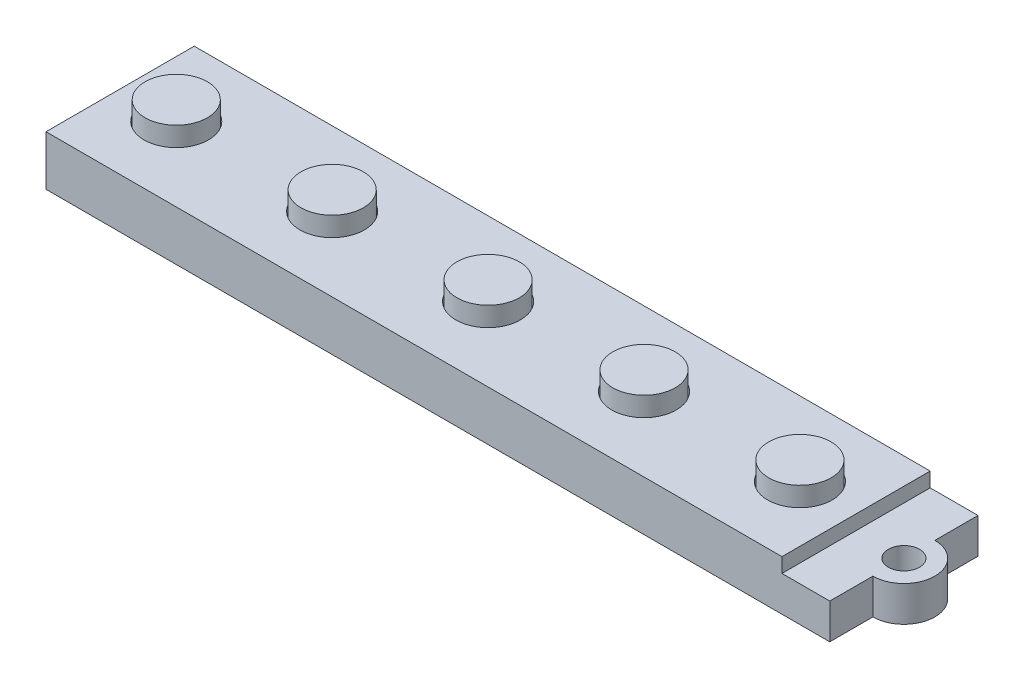
ISO-10303-21;
HEADER;
FILE_DESCRIPTION(('STEP AP214'),'2;1');
FILE_NAME('part.step','',(''),(''),'','','');
FILE_SCHEMA(('AUTOMOTIVE_DESIGN { 1 0 10303 214 1 1 1 1 }'));
ENDSEC;
DATA;
#1=APPLICATION_CONTEXT('core data for automotive mechanical design processes');
#2=APPLICATION_PROTOCOL_DEFINITION('international standard','automotive_design',2000,#1);
#3=PRODUCT_CONTEXT('',#1,'mechanical');
#4=PRODUCT('Part','Part','',(#3));
#5=PRODUCT_RELATED_PRODUCT_CATEGORY('part','',(#4));
#6=PRODUCT_DEFINITION_FORMATION('','',#4);
#7=PRODUCT_DEFINITION_CONTEXT('part definition',#1,'design');
#8=PRODUCT_DEFINITION('design','',#6,#7);
#9=PRODUCT_DEFINITION_SHAPE('','',#8);
#10=(LENGTH_UNIT() NAMED_UNIT(*) SI_UNIT(.MILLI.,.METRE.));
#11=(NAMED_UNIT(*) PLANE_ANGLE_UNIT() SI_UNIT($,.RADIAN.));
#12=(NAMED_UNIT(*) SI_UNIT($,.STERADIAN.) SOLID_ANGLE_UNIT());
#13=UNCERTAINTY_MEASURE_WITH_UNIT(LENGTH_MEASURE(1.E-05),#10,'distance_accuracy_value','');
#14=(GEOMETRIC_REPRESENTATION_CONTEXT(3) GLOBAL_UNCERTAINTY_ASSIGNED_CONTEXT((#13)) GLOBAL_UNIT_ASSIGNED_CONTEXT((#10,
#11,#12)) REPRESENTATION_CONTEXT('',''));
#15=CARTESIAN_POINT('',(0.,0.,0.));
#16=DIRECTION('',(0.,0.,1.));
#17=DIRECTION('',(1.,0.,0.));
#18=AXIS2_PLACEMENT_3D('',#15,#16,#17);
#19=CARTESIAN_POINT('',(0.,0.,0.));
#20=DIRECTION('',(0.,1.,0.));
#21=DIRECTION('',(0.,0.,1.));
#22=AXIS2_PLACEMENT_3D('',#19,#20,#21);
#23=PLANE('',#22);
#24=CARTESIAN_POINT('',(-20.4046666666667,0.,-25.8942737373737));
#25=DIRECTION('',(0.,1.,0.));
#26=DIRECTION('',(0.,0.,1.));
#27=AXIS2_PLACEMENT_3D('',#24,#25,#26);
#28=CIRCLE('',#27,1.905);
#29=CARTESIAN_POINT('',(-20.4046666666667,0.,-23.9892737373737));
#30=VERTEX_POINT('',#29);
#31=EDGE_CURVE('E220',#30,#30,#28,.T.);
#32=ORIENTED_EDGE('',*,*,#31,.T.);
#33=EDGE_LOOP('',(#32));
#34=FACE_BOUND('',#33,.T.);
#35=DIRECTION('',(0.,0.,-1.));
#36=VECTOR('',#35,1.);
#37=CARTESIAN_POINT('',(-112.479666666667,0.,-32.2442737373737));
#38=LINE('',#37,#36);
#39=CARTESIAN_POINT('',(-112.479666666667,0.,-19.5442737373737));
#40=VERTEX_POINT('',#39);
#41=CARTESIAN_POINT('',(-112.479666666667,0.,-32.2442737373737));
#42=VERTEX_POINT('',#41);
#43=EDGE_CURVE('E159',#40,#42,#38,.T.);
#44=ORIENTED_EDGE('',*,*,#43,.F.);
#45=DIRECTION('',(-1.,0.,0.));
#46=VECTOR('',#45,1.);
#47=CARTESIAN_POINT('',(-29.9296666666666,0.,-19.5442737373737));
#48=LINE('',#47,#46);
#49=CARTESIAN_POINT('',(-29.9296666666666,0.,-19.5442737373737));
#50=VERTEX_POINT('',#49);
#51=EDGE_CURVE('E164',#50,#40,#48,.T.);
#52=ORIENTED_EDGE('',*,*,#51,.F.);
#53=DIRECTION('',(0.,0.,1.));
#54=VECTOR('',#53,1.);
#55=CARTESIAN_POINT('',(-29.9296666666666,0.,-32.2442737373737));
#56=LINE('',#55,#54);
#57=CARTESIAN_POINT('',(-29.9296666666666,0.,-32.2442737373737));
#58=VERTEX_POINT('',#57);
#59=EDGE_CURVE('E174',#58,#50,#56,.T.);
#60=ORIENTED_EDGE('',*,*,#59,.F.);
#61=DIRECTION('',(1.,0.,0.));
#62=VECTOR('',#61,1.);
#63=CARTESIAN_POINT('',(-29.9296666666666,0.,-32.2442737373737));
#64=LINE('',#63,#62);
#65=EDGE_CURVE('E57',#42,#58,#64,.T.);
#66=ORIENTED_EDGE('',*,*,#65,.F.);
#67=EDGE_LOOP('',(#44,#52,#60,#66));
#68=FACE_BOUND('',#67,.T.);
#69=DIRECTION('',(-1.,0.,0.));
#70=VECTOR('',#69,1.);
#71=CARTESIAN_POINT('',(-116.162666666667,0.,-34.9493737373737));
#72=LINE('',#71,#70);
#73=CARTESIAN_POINT('',(-20.4046666666667,0.,-34.9493737373737));
#74=VERTEX_POINT('',#73);
#75=CARTESIAN_POINT('',(-116.162666666667,0.,-34.9493737373737));
#76=VERTEX_POINT('',#75);
#77=EDGE_CURVE('E242',#74,#76,#72,.T.);
#78=ORIENTED_EDGE('',*,*,#77,.F.);
#79=DIRECTION('',(0.,0.,1.));
#80=VECTOR('',#79,1.);
#81=CARTESIAN_POINT('',(-20.4046666666667,0.,0.));
#82=LINE('',#81,#80);
#83=CARTESIAN_POINT('',(-20.4046666666667,0.,-29.6800450522713));
#84=VERTEX_POINT('',#83);
#85=EDGE_CURVE('E156',#74,#84,#82,.T.);
#86=ORIENTED_EDGE('',*,*,#85,.T.);
#87=CARTESIAN_POINT('',(-20.4046666666667,0.,-25.8942737373737));
#88=DIRECTION('',(0.,1.,0.));
#89=DIRECTION('',(0.,0.,1.));
#90=AXIS2_PLACEMENT_3D('',#87,#88,#89);
#91=CIRCLE('',#90,3.78577131489756);
#92=CARTESIAN_POINT('',(-20.4046666666667,0.,-22.1085024224762));
#93=VERTEX_POINT('',#92);
#94=EDGE_CURVE('E152',#84,#93,#91,.F.);
#95=ORIENTED_EDGE('',*,*,#94,.T.);
#96=DIRECTION('',(0.,0.,1.));
#97=VECTOR('',#96,1.);
#98=CARTESIAN_POINT('',(-20.4046666666666,0.,0.));
#99=LINE('',#98,#97);
#100=CARTESIAN_POINT('',(-20.4046666666666,0.,-16.8391737373737));
#101=VERTEX_POINT('',#100);
#102=EDGE_CURVE('E130',#93,#101,#99,.T.);
#103=ORIENTED_EDGE('',*,*,#102,.T.);
#104=DIRECTION('',(1.,0.,0.));
#105=VECTOR('',#104,1.);
#106=CARTESIAN_POINT('',(-116.162666666667,0.,-16.8391737373737));
#107=LINE('',#106,#105);
#108=CARTESIAN_POINT('',(-116.162666666667,0.,-16.8391737373737));
#109=VERTEX_POINT('',#108);
#110=EDGE_CURVE('E249',#109,#101,#107,.T.);
#111=ORIENTED_EDGE('',*,*,#110,.F.);
#112=DIRECTION('',(0.,0.,1.));
#113=VECTOR('',#112,1.);
#114=CARTESIAN_POINT('',(-116.162666666667,0.,-34.9493737373737));
#115=LINE('',#114,#113);
#116=EDGE_CURVE('E235',#76,#109,#115,.T.);
#117=ORIENTED_EDGE('',*,*,#116,.F.);
#118=EDGE_LOOP('',(#78,#86,#95,#103,#111,#117));
#119=FACE_BOUND('',#118,.T.);
#120=ADVANCED_FACE('F34',(#34,#68,#119),#23,.F.);
#121=CARTESIAN_POINT('',(0.,4.318,0.));
#122=DIRECTION('',(0.,1.,0.));
#123=DIRECTION('',(0.,0.,1.));
#124=AXIS2_PLACEMENT_3D('',#121,#122,#123);
#125=PLANE('',#124);
#126=CARTESIAN_POINT('',(-20.4046666666667,4.318,-25.8942737373737));
#127=DIRECTION('',(0.,1.,0.));
#128=DIRECTION('',(0.,0.,1.));
#129=AXIS2_PLACEMENT_3D('',#126,#127,#128);
#130=CIRCLE('',#129,1.905);
#131=CARTESIAN_POINT('',(-20.4046666666667,4.318,-23.9892737373737));
#132=VERTEX_POINT('',#131);
#133=EDGE_CURVE('E217',#132,#132,#130,.T.);
#134=ORIENTED_EDGE('',*,*,#133,.F.);
#135=EDGE_LOOP('',(#134));
#136=FACE_BOUND('',#135,.T.);
#137=DIRECTION('',(0.,0.,1.));
#138=VECTOR('',#137,1.);
#139=CARTESIAN_POINT('',(-20.4046666666667,4.318,-34.9493737373737));
#140=LINE('',#139,#138);
#141=CARTESIAN_POINT('',(-20.4046666666667,4.318,-34.9493737373737));
#142=VERTEX_POINT('',#141);
#143=CARTESIAN_POINT('',(-20.4046666666667,4.318,-29.6800450522713));
#144=VERTEX_POINT('',#143);
#145=EDGE_CURVE('E49',#142,#144,#140,.T.);
#146=ORIENTED_EDGE('',*,*,#145,.F.);
#147=DIRECTION('',(-1.,0.,0.));
#148=VECTOR('',#147,1.);
#149=CARTESIAN_POINT('',(-26.2466666666667,4.318,-34.9493737373737));
#150=LINE('',#149,#148);
#151=CARTESIAN_POINT('',(-26.2466666666667,4.318,-34.9493737373737));
#152=VERTEX_POINT('',#151);
#153=EDGE_CURVE('E229',#142,#152,#150,.T.);
#154=ORIENTED_EDGE('',*,*,#153,.T.);
#155=DIRECTION('',(0.,0.,1.));
#156=VECTOR('',#155,1.);
#157=CARTESIAN_POINT('',(-26.2466666666667,4.318,-34.9493737373737));
#158=LINE('',#157,#156);
#159=CARTESIAN_POINT('',(-26.2466666666667,4.318,-16.8391737373737));
#160=VERTEX_POINT('',#159);
#161=EDGE_CURVE('E226',#152,#160,#158,.T.);
#162=ORIENTED_EDGE('',*,*,#161,.T.);
#163=DIRECTION('',(1.,0.,0.));
#164=VECTOR('',#163,1.);
#165=CARTESIAN_POINT('',(-26.2466666666667,4.318,-16.8391737373737));
#166=LINE('',#165,#164);
#167=CARTESIAN_POINT('',(-20.4046666666666,4.318,-16.8391737373737));
#168=VERTEX_POINT('',#167);
#169=EDGE_CURVE('E145',#160,#168,#166,.T.);
#170=ORIENTED_EDGE('',*,*,#169,.T.);
#171=DIRECTION('',(0.,0.,1.));
#172=VECTOR('',#171,1.);
#173=CARTESIAN_POINT('',(-20.4046666666667,4.318,-22.1085024224762));
#174=LINE('',#173,#172);
#175=CARTESIAN_POINT('',(-20.4046666666667,4.318,-22.1085024224762));
#176=VERTEX_POINT('',#175);
#177=EDGE_CURVE('E127',#176,#168,#174,.T.);
#178=ORIENTED_EDGE('',*,*,#177,.F.);
#179=CARTESIAN_POINT('',(-20.4046666666667,4.318,-25.8942737373737));
#180=DIRECTION('',(0.,-1.,0.));
#181=DIRECTION('',(0.,0.,1.));
#182=AXIS2_PLACEMENT_3D('',#179,#180,#181);
#183=CIRCLE('',#182,3.78577131489756);
#184=EDGE_CURVE('E137',#144,#176,#183,.T.);
#185=ORIENTED_EDGE('',*,*,#184,.F.);
#186=EDGE_LOOP('',(#146,#154,#162,#170,#178,#185));
#187=FACE_BOUND('',#186,.T.);
#188=ADVANCED_FACE('F142',(#136,#187),#125,.T.);
#189=CARTESIAN_POINT('',(-116.162666666667,6.096,-34.9493737373737));
#190=DIRECTION('',(1.,0.,0.));
#191=DIRECTION('',(0.,0.,-1.));
#192=AXIS2_PLACEMENT_3D('',#189,#190,#191);
#193=PLANE('',#192);
#194=ORIENTED_EDGE('',*,*,#116,.T.);
#195=DIRECTION('',(0.,-1.,0.));
#196=VECTOR('',#195,1.);
#197=CARTESIAN_POINT('',(-116.162666666667,6.096,-16.8391737373737));
#198=LINE('',#197,#196);
#199=CARTESIAN_POINT('',(-116.162666666667,6.096,-16.8391737373737));
#200=VERTEX_POINT('',#199);
#201=EDGE_CURVE('E11',#200,#109,#198,.T.);
#202=ORIENTED_EDGE('',*,*,#201,.F.);
#203=DIRECTION('',(0.,0.,1.));
#204=VECTOR('',#203,1.);
#205=CARTESIAN_POINT('',(-116.162666666667,6.096,-34.9493737373737));
#206=LINE('',#205,#204);
#207=CARTESIAN_POINT('',(-116.162666666667,6.096,-34.9493737373737));
#208=VERTEX_POINT('',#207);
#209=EDGE_CURVE('E238',#208,#200,#206,.T.);
#210=ORIENTED_EDGE('',*,*,#209,.F.);
#211=DIRECTION('',(0.,-1.,0.));
#212=VECTOR('',#211,1.);
#213=CARTESIAN_POINT('',(-116.162666666667,6.096,-34.9493737373737));
#214=LINE('',#213,#212);
#215=EDGE_CURVE('E42',#208,#76,#214,.T.);
#216=ORIENTED_EDGE('',*,*,#215,.T.);
#217=EDGE_LOOP('',(#194,#202,#210,#216));
#218=FACE_BOUND('',#217,.T.);
#219=ADVANCED_FACE('F36',(#218),#193,.F.);
#220=CARTESIAN_POINT('',(-116.162666666667,6.096,-16.8391737373737));
#221=DIRECTION('',(0.,0.,-1.));
#222=DIRECTION('',(-1.,0.,0.));
#223=AXIS2_PLACEMENT_3D('',#220,#221,#222);
#224=PLANE('',#223);
#225=ORIENTED_EDGE('',*,*,#110,.T.);
#226=DIRECTION('',(0.,1.,0.));
#227=VECTOR('',#226,1.);
#228=CARTESIAN_POINT('',(-20.4046666666666,-1.27,-16.8391737373737));
#229=LINE('',#228,#227);
#230=EDGE_CURVE('E133',#101,#168,#229,.T.);
#231=ORIENTED_EDGE('',*,*,#230,.T.);
#232=ORIENTED_EDGE('',*,*,#169,.F.);
#233=DIRECTION('',(0.,1.,0.));
#234=VECTOR('',#233,1.);
#235=CARTESIAN_POINT('',(-26.2466666666667,4.318,-16.8391737373737));
#236=LINE('',#235,#234);
#237=CARTESIAN_POINT('',(-26.2466666666667,6.096,-16.8391737373737));
#238=VERTEX_POINT('',#237);
#239=EDGE_CURVE('E231',#160,#238,#236,.T.);
#240=ORIENTED_EDGE('',*,*,#239,.T.);
#241=DIRECTION('',(1.,0.,0.));
#242=VECTOR('',#241,1.);
#243=CARTESIAN_POINT('',(-116.162666666667,6.096,-16.8391737373737));
#244=LINE('',#243,#242);
#245=EDGE_CURVE('E241',#200,#238,#244,.T.);
#246=ORIENTED_EDGE('',*,*,#245,.F.);
#247=ORIENTED_EDGE('',*,*,#201,.T.);
#248=EDGE_LOOP('',(#225,#231,#232,#240,#246,#247));
#249=FACE_BOUND('',#248,.T.);
#250=ADVANCED_FACE('F263',(#249),#224,.F.);
#251=CARTESIAN_POINT('',(-116.162666666667,6.096,-34.9493737373737));
#252=DIRECTION('',(0.,0.,1.));
#253=DIRECTION('',(1.,0.,0.));
#254=AXIS2_PLACEMENT_3D('',#251,#252,#253);
#255=PLANE('',#254);
#256=ORIENTED_EDGE('',*,*,#153,.F.);
#257=DIRECTION('',(0.,1.,0.));
#258=VECTOR('',#257,1.);
#259=CARTESIAN_POINT('',(-20.4046666666667,-1.27,-34.9493737373737));
#260=LINE('',#259,#258);
#261=EDGE_CURVE('E150',#74,#142,#260,.T.);
#262=ORIENTED_EDGE('',*,*,#261,.F.);
#263=ORIENTED_EDGE('',*,*,#77,.T.);
#264=ORIENTED_EDGE('',*,*,#215,.F.);
#265=DIRECTION('',(-1.,0.,0.));
#266=VECTOR('',#265,1.);
#267=CARTESIAN_POINT('',(-116.162666666667,6.096,-34.9493737373737));
#268=LINE('',#267,#266);
#269=CARTESIAN_POINT('',(-26.2466666666667,6.096,-34.9493737373737));
#270=VERTEX_POINT('',#269);
#271=EDGE_CURVE('E245',#270,#208,#268,.T.);
#272=ORIENTED_EDGE('',*,*,#271,.F.);
#273=DIRECTION('',(0.,1.,0.));
#274=VECTOR('',#273,1.);
#275=CARTESIAN_POINT('',(-26.2466666666667,4.318,-34.9493737373737));
#276=LINE('',#275,#274);
#277=EDGE_CURVE('E233',#152,#270,#276,.T.);
#278=ORIENTED_EDGE('',*,*,#277,.F.);
#279=EDGE_LOOP('',(#256,#262,#263,#264,#272,#278));
#280=FACE_BOUND('',#279,.T.);
#281=ADVANCED_FACE('F269',(#280),#255,.F.);
#282=CARTESIAN_POINT('',(0.,6.096,0.));
#283=DIRECTION('',(0.,1.,0.));
#284=DIRECTION('',(0.,0.,1.));
#285=AXIS2_PLACEMENT_3D('',#282,#283,#284);
#286=PLANE('',#285);
#287=CARTESIAN_POINT('',(-52.1546666666667,6.096,-25.8942737373736));
#288=DIRECTION('',(0.,1.,0.));
#289=DIRECTION('',(0.,0.,1.));
#290=AXIS2_PLACEMENT_3D('',#287,#288,#289);
#291=CIRCLE('',#290,3.937);
#292=CARTESIAN_POINT('',(-52.1546666666667,6.096,-21.9572737373736));
#293=VERTEX_POINT('',#292);
#294=EDGE_CURVE('E194',#293,#293,#291,.T.);
#295=ORIENTED_EDGE('',*,*,#294,.F.);
#296=EDGE_LOOP('',(#295));
#297=FACE_BOUND('',#296,.T.);
#298=CARTESIAN_POINT('',(-71.2046666666667,6.096,-25.8942737373734));
#299=DIRECTION('',(0.,1.,0.));
#300=DIRECTION('',(0.,0.,1.));
#301=AXIS2_PLACEMENT_3D('',#298,#299,#300);
#302=CIRCLE('',#301,3.937);
#303=CARTESIAN_POINT('',(-71.2046666666667,6.096,-21.9572737373734));
#304=VERTEX_POINT('',#303);
#305=EDGE_CURVE('E200',#304,#304,#302,.T.);
#306=ORIENTED_EDGE('',*,*,#305,.F.);
#307=EDGE_LOOP('',(#306));
#308=FACE_BOUND('',#307,.T.);
#309=CARTESIAN_POINT('',(-90.2546666666667,6.096,-25.8942737373733));
#310=DIRECTION('',(0.,1.,0.));
#311=DIRECTION('',(0.,0.,1.));
#312=AXIS2_PLACEMENT_3D('',#309,#310,#311);
#313=CIRCLE('',#312,3.937);
#314=CARTESIAN_POINT('',(-90.2546666666667,6.096,-21.9572737373733));
#315=VERTEX_POINT('',#314);
#316=EDGE_CURVE('E206',#315,#315,#313,.T.);
#317=ORIENTED_EDGE('',*,*,#316,.F.);
#318=EDGE_LOOP('',(#317));
#319=FACE_BOUND('',#318,.T.);
#320=CARTESIAN_POINT('',(-109.304666666667,6.096,-25.8942737373732));
#321=DIRECTION('',(0.,1.,0.));
#322=DIRECTION('',(0.,0.,1.));
#323=AXIS2_PLACEMENT_3D('',#320,#321,#322);
#324=CIRCLE('',#323,3.937);
#325=CARTESIAN_POINT('',(-109.304666666667,6.096,-21.9572737373732));
#326=VERTEX_POINT('',#325);
#327=EDGE_CURVE('E189',#326,#326,#324,.T.);
#328=ORIENTED_EDGE('',*,*,#327,.F.);
#329=EDGE_LOOP('',(#328));
#330=FACE_BOUND('',#329,.T.);
#331=CARTESIAN_POINT('',(-33.1046666666667,6.096,-25.8942737373737));
#332=DIRECTION('',(0.,1.,0.));
#333=DIRECTION('',(0.,0.,1.));
#334=AXIS2_PLACEMENT_3D('',#331,#332,#333);
#335=CIRCLE('',#334,3.937);
#336=CARTESIAN_POINT('',(-33.1046666666667,6.096,-21.9572737373737));
#337=VERTEX_POINT('',#336);
#338=EDGE_CURVE('E193',#337,#337,#335,.T.);
#339=ORIENTED_EDGE('',*,*,#338,.F.);
#340=EDGE_LOOP('',(#339));
#341=FACE_BOUND('',#340,.T.);
#342=DIRECTION('',(0.,0.,1.));
#343=VECTOR('',#342,1.);
#344=CARTESIAN_POINT('',(-26.2466666666667,6.096,-34.9493737373737));
#345=LINE('',#344,#343);
#346=EDGE_CURVE('E223',#270,#238,#345,.T.);
#347=ORIENTED_EDGE('',*,*,#346,.F.);
#348=ORIENTED_EDGE('',*,*,#271,.T.);
#349=ORIENTED_EDGE('',*,*,#209,.T.);
#350=ORIENTED_EDGE('',*,*,#245,.T.);
#351=EDGE_LOOP('',(#347,#348,#349,#350));
#352=FACE_BOUND('',#351,.T.);
#353=ADVANCED_FACE('F266',(#297,#308,#319,#330,#341,#352),#286,.T.);
#354=CARTESIAN_POINT('',(-26.2466666666667,4.318,-34.9493737373737));
#355=DIRECTION('',(-1.,0.,0.));
#356=DIRECTION('',(0.,0.,1.));
#357=AXIS2_PLACEMENT_3D('',#354,#355,#356);
#358=PLANE('',#357);
#359=ORIENTED_EDGE('',*,*,#346,.T.);
#360=ORIENTED_EDGE('',*,*,#239,.F.);
#361=ORIENTED_EDGE('',*,*,#161,.F.);
#362=ORIENTED_EDGE('',*,*,#277,.T.);
#363=EDGE_LOOP('',(#359,#360,#361,#362));
#364=FACE_BOUND('',#363,.T.);
#365=ADVANCED_FACE('F273',(#364),#358,.F.);
#366=CARTESIAN_POINT('',(-20.4046666666667,0.,-25.8942737373737));
#367=DIRECTION('',(0.,1.,0.));
#368=DIRECTION('',(0.,0.,1.));
#369=AXIS2_PLACEMENT_3D('',#366,#367,#368);
#370=CYLINDRICAL_SURFACE('',#369,1.905);
#371=ORIENTED_EDGE('',*,*,#31,.F.);
#372=EDGE_LOOP('',(#371));
#373=FACE_BOUND('',#372,.T.);
#374=ORIENTED_EDGE('',*,*,#133,.T.);
#375=EDGE_LOOP('',(#374));
#376=FACE_BOUND('',#375,.T.);
#377=ADVANCED_FACE('F337',(#373,#376),#370,.F.);
#378=CARTESIAN_POINT('',(-33.1046666666667,4.826,-25.8942737373737));
#379=DIRECTION('',(0.,1.,0.));
#380=DIRECTION('',(0.,0.,1.));
#381=AXIS2_PLACEMENT_3D('',#378,#379,#380);
#382=CYLINDRICAL_SURFACE('',#381,3.937);
#383=CARTESIAN_POINT('',(-33.1046666666667,4.826,-25.8942737373737));
#384=DIRECTION('',(0.,1.,0.));
#385=DIRECTION('',(0.,0.,1.));
#386=AXIS2_PLACEMENT_3D('',#383,#384,#385);
#387=CIRCLE('',#386,3.937);
#388=CARTESIAN_POINT('',(-33.1046666666667,4.826,-21.9572737373737));
#389=VERTEX_POINT('',#388);
#390=EDGE_CURVE('E214',#389,#389,#387,.T.);
#391=ORIENTED_EDGE('',*,*,#390,.F.);
#392=EDGE_LOOP('',(#391));
#393=FACE_BOUND('',#392,.T.);
#394=ORIENTED_EDGE('',*,*,#338,.T.);
#395=EDGE_LOOP('',(#394));
#396=FACE_BOUND('',#395,.T.);
#397=ADVANCED_FACE('F335',(#393,#396),#382,.F.);
#398=CARTESIAN_POINT('',(-33.1046666666667,4.826,-25.8942737373737));
#399=DIRECTION('',(0.,1.,0.));
#400=DIRECTION('',(0.,0.,1.));
#401=AXIS2_PLACEMENT_3D('',#398,#399,#400);
#402=PLANE('',#401);
#403=CARTESIAN_POINT('',(-33.1046666666667,4.826,-25.8942737373737));
#404=DIRECTION('',(0.,1.,0.));
#405=DIRECTION('',(0.,0.,1.));
#406=AXIS2_PLACEMENT_3D('',#403,#404,#405);
#407=CIRCLE('',#406,3.81);
#408=CARTESIAN_POINT('',(-33.1046666666667,4.826,-22.0842737373737));
#409=VERTEX_POINT('',#408);
#410=EDGE_CURVE('E276',#409,#409,#407,.T.);
#411=ORIENTED_EDGE('',*,*,#410,.F.);
#412=EDGE_LOOP('',(#411));
#413=FACE_BOUND('',#412,.T.);
#414=ORIENTED_EDGE('',*,*,#390,.T.);
#415=EDGE_LOOP('',(#414));
#416=FACE_BOUND('',#415,.T.);
#417=ADVANCED_FACE('F325',(#413,#416),#402,.T.);
#418=CARTESIAN_POINT('',(-109.304666666667,4.826,-25.8942737373732));
#419=DIRECTION('',(0.,1.,0.));
#420=DIRECTION('',(0.,0.,1.));
#421=AXIS2_PLACEMENT_3D('',#418,#419,#420);
#422=CYLINDRICAL_SURFACE('',#421,3.937);
#423=CARTESIAN_POINT('',(-109.304666666667,4.826,-25.8942737373732));
#424=DIRECTION('',(0.,1.,0.));
#425=DIRECTION('',(0.,0.,1.));
#426=AXIS2_PLACEMENT_3D('',#423,#424,#425);
#427=CIRCLE('',#426,3.937);
#428=CARTESIAN_POINT('',(-109.304666666667,4.826,-21.9572737373732));
#429=VERTEX_POINT('',#428);
#430=EDGE_CURVE('E209',#429,#429,#427,.T.);
#431=ORIENTED_EDGE('',*,*,#430,.F.);
#432=EDGE_LOOP('',(#431));
#433=FACE_BOUND('',#432,.T.);
#434=ORIENTED_EDGE('',*,*,#327,.T.);
#435=EDGE_LOOP('',(#434));
#436=FACE_BOUND('',#435,.T.);
#437=ADVANCED_FACE('F319',(#433,#436),#422,.F.);
#438=CARTESIAN_POINT('',(-109.304666666667,4.826,-25.8942737373732));
#439=DIRECTION('',(0.,1.,0.));
#440=DIRECTION('',(0.,0.,1.));
#441=AXIS2_PLACEMENT_3D('',#438,#439,#440);
#442=PLANE('',#441);
#443=CARTESIAN_POINT('',(-109.304666666667,4.826,-25.8942737373732));
#444=DIRECTION('',(0.,1.,0.));
#445=DIRECTION('',(0.,0.,1.));
#446=AXIS2_PLACEMENT_3D('',#443,#444,#445);
#447=CIRCLE('',#446,3.81);
#448=CARTESIAN_POINT('',(-109.304666666667,4.826,-22.0842737373732));
#449=VERTEX_POINT('',#448);
#450=EDGE_CURVE('E300',#449,#449,#447,.T.);
#451=ORIENTED_EDGE('',*,*,#450,.F.);
#452=EDGE_LOOP('',(#451));
#453=FACE_BOUND('',#452,.T.);
#454=ORIENTED_EDGE('',*,*,#430,.T.);
#455=EDGE_LOOP('',(#454));
#456=FACE_BOUND('',#455,.T.);
#457=ADVANCED_FACE('F315',(#453,#456),#442,.T.);
#458=CARTESIAN_POINT('',(-90.2546666666667,4.826,-25.8942737373733));
#459=DIRECTION('',(0.,1.,0.));
#460=DIRECTION('',(0.,0.,1.));
#461=AXIS2_PLACEMENT_3D('',#458,#459,#460);
#462=CYLINDRICAL_SURFACE('',#461,3.937);
#463=CARTESIAN_POINT('',(-90.2546666666667,4.826,-25.8942737373733));
#464=DIRECTION('',(0.,1.,0.));
#465=DIRECTION('',(0.,0.,1.));
#466=AXIS2_PLACEMENT_3D('',#463,#464,#465);
#467=CIRCLE('',#466,3.937);
#468=CARTESIAN_POINT('',(-90.2546666666667,4.826,-21.9572737373733));
#469=VERTEX_POINT('',#468);
#470=EDGE_CURVE('E203',#469,#469,#467,.T.);
#471=ORIENTED_EDGE('',*,*,#470,.F.);
#472=EDGE_LOOP('',(#471));
#473=FACE_BOUND('',#472,.T.);
#474=ORIENTED_EDGE('',*,*,#316,.T.);
#475=EDGE_LOOP('',(#474));
#476=FACE_BOUND('',#475,.T.);
#477=ADVANCED_FACE('F318',(#473,#476),#462,.F.);
#478=CARTESIAN_POINT('',(-90.2546666666667,4.826,-25.8942737373733));
#479=DIRECTION('',(0.,1.,0.));
#480=DIRECTION('',(0.,0.,1.));
#481=AXIS2_PLACEMENT_3D('',#478,#479,#480);
#482=PLANE('',#481);
#483=CARTESIAN_POINT('',(-90.2546666666667,4.826,-25.8942737373733));
#484=DIRECTION('',(0.,1.,0.));
#485=DIRECTION('',(0.,0.,1.));
#486=AXIS2_PLACEMENT_3D('',#483,#484,#485);
#487=CIRCLE('',#486,3.81);
#488=CARTESIAN_POINT('',(-90.2546666666667,4.826,-22.0842737373733));
#489=VERTEX_POINT('',#488);
#490=EDGE_CURVE('E294',#489,#489,#487,.T.);
#491=ORIENTED_EDGE('',*,*,#490,.F.);
#492=EDGE_LOOP('',(#491));
#493=FACE_BOUND('',#492,.T.);
#494=ORIENTED_EDGE('',*,*,#470,.T.);
#495=EDGE_LOOP('',(#494));
#496=FACE_BOUND('',#495,.T.);
#497=ADVANCED_FACE('F463',(#493,#496),#482,.T.);
#498=CARTESIAN_POINT('',(-71.2046666666667,4.826,-25.8942737373734));
#499=DIRECTION('',(0.,1.,0.));
#500=DIRECTION('',(0.,0.,1.));
#501=AXIS2_PLACEMENT_3D('',#498,#499,#500);
#502=CYLINDRICAL_SURFACE('',#501,3.937);
#503=CARTESIAN_POINT('',(-71.2046666666667,4.826,-25.8942737373734));
#504=DIRECTION('',(0.,1.,0.));
#505=DIRECTION('',(0.,0.,1.));
#506=AXIS2_PLACEMENT_3D('',#503,#504,#505);
#507=CIRCLE('',#506,3.937);
#508=CARTESIAN_POINT('',(-71.2046666666667,4.826,-21.9572737373734));
#509=VERTEX_POINT('',#508);
#510=EDGE_CURVE('E197',#509,#509,#507,.T.);
#511=ORIENTED_EDGE('',*,*,#510,.F.);
#512=EDGE_LOOP('',(#511));
#513=FACE_BOUND('',#512,.T.);
#514=ORIENTED_EDGE('',*,*,#305,.T.);
#515=EDGE_LOOP('',(#514));
#516=FACE_BOUND('',#515,.T.);
#517=ADVANCED_FACE('F457',(#513,#516),#502,.F.);
#518=CARTESIAN_POINT('',(-71.2046666666667,4.826,-25.8942737373734));
#519=DIRECTION('',(0.,1.,0.));
#520=DIRECTION('',(0.,0.,1.));
#521=AXIS2_PLACEMENT_3D('',#518,#519,#520);
#522=PLANE('',#521);
#523=CARTESIAN_POINT('',(-71.2046666666667,4.826,-25.8942737373734));
#524=DIRECTION('',(0.,1.,0.));
#525=DIRECTION('',(0.,0.,1.));
#526=AXIS2_PLACEMENT_3D('',#523,#524,#525);
#527=CIRCLE('',#526,3.81000000000001);
#528=CARTESIAN_POINT('',(-71.2046666666667,4.826,-22.0842737373734));
#529=VERTEX_POINT('',#528);
#530=EDGE_CURVE('E288',#529,#529,#527,.T.);
#531=ORIENTED_EDGE('',*,*,#530,.F.);
#532=EDGE_LOOP('',(#531));
#533=FACE_BOUND('',#532,.T.);
#534=ORIENTED_EDGE('',*,*,#510,.T.);
#535=EDGE_LOOP('',(#534));
#536=FACE_BOUND('',#535,.T.);
#537=ADVANCED_FACE('F449',(#533,#536),#522,.T.);
#538=CARTESIAN_POINT('',(-52.1546666666667,4.826,-25.8942737373736));
#539=DIRECTION('',(0.,1.,0.));
#540=DIRECTION('',(0.,0.,1.));
#541=AXIS2_PLACEMENT_3D('',#538,#539,#540);
#542=CYLINDRICAL_SURFACE('',#541,3.937);
#543=CARTESIAN_POINT('',(-52.1546666666667,4.826,-25.8942737373736));
#544=DIRECTION('',(0.,1.,0.));
#545=DIRECTION('',(0.,0.,1.));
#546=AXIS2_PLACEMENT_3D('',#543,#544,#545);
#547=CIRCLE('',#546,3.937);
#548=CARTESIAN_POINT('',(-52.1546666666667,4.826,-21.9572737373736));
#549=VERTEX_POINT('',#548);
#550=EDGE_CURVE('E190',#549,#549,#547,.T.);
#551=ORIENTED_EDGE('',*,*,#550,.F.);
#552=EDGE_LOOP('',(#551));
#553=FACE_BOUND('',#552,.T.);
#554=ORIENTED_EDGE('',*,*,#294,.T.);
#555=EDGE_LOOP('',(#554));
#556=FACE_BOUND('',#555,.T.);
#557=ADVANCED_FACE('F443',(#553,#556),#542,.F.);
#558=CARTESIAN_POINT('',(-52.1546666666667,4.826,-25.8942737373736));
#559=DIRECTION('',(0.,1.,0.));
#560=DIRECTION('',(0.,0.,1.));
#561=AXIS2_PLACEMENT_3D('',#558,#559,#560);
#562=PLANE('',#561);
#563=CARTESIAN_POINT('',(-52.1546666666667,4.826,-25.8942737373736));
#564=DIRECTION('',(0.,1.,0.));
#565=DIRECTION('',(0.,0.,1.));
#566=AXIS2_PLACEMENT_3D('',#563,#564,#565);
#567=CIRCLE('',#566,3.81);
#568=CARTESIAN_POINT('',(-52.1546666666667,4.826,-22.0842737373736));
#569=VERTEX_POINT('',#568);
#570=EDGE_CURVE('E282',#569,#569,#567,.T.);
#571=ORIENTED_EDGE('',*,*,#570,.F.);
#572=EDGE_LOOP('',(#571));
#573=FACE_BOUND('',#572,.T.);
#574=ORIENTED_EDGE('',*,*,#550,.T.);
#575=EDGE_LOOP('',(#574));
#576=FACE_BOUND('',#575,.T.);
#577=ADVANCED_FACE('F435',(#573,#576),#562,.T.);
#578=CARTESIAN_POINT('',(-112.479666666667,-1.27,-32.2442737373737));
#579=DIRECTION('',(1.,0.,0.));
#580=DIRECTION('',(0.,0.,-1.));
#581=AXIS2_PLACEMENT_3D('',#578,#579,#580);
#582=PLANE('',#581);
#583=ORIENTED_EDGE('',*,*,#43,.T.);
#584=DIRECTION('',(0.,1.,0.));
#585=VECTOR('',#584,1.);
#586=CARTESIAN_POINT('',(-112.479666666667,-1.27,-32.2442737373737));
#587=LINE('',#586,#585);
#588=CARTESIAN_POINT('',(-112.479666666667,-1.27,-32.2442737373737));
#589=VERTEX_POINT('',#588);
#590=EDGE_CURVE('E187',#589,#42,#587,.T.);
#591=ORIENTED_EDGE('',*,*,#590,.F.);
#592=DIRECTION('',(0.,0.,-1.));
#593=VECTOR('',#592,1.);
#594=CARTESIAN_POINT('',(-112.479666666667,-1.27,-32.2442737373737));
#595=LINE('',#594,#593);
#596=CARTESIAN_POINT('',(-112.479666666667,-1.27,-19.5442737373737));
#597=VERTEX_POINT('',#596);
#598=EDGE_CURVE('E160',#597,#589,#595,.T.);
#599=ORIENTED_EDGE('',*,*,#598,.F.);
#600=DIRECTION('',(0.,1.,0.));
#601=VECTOR('',#600,1.);
#602=CARTESIAN_POINT('',(-112.479666666667,-1.27,-19.5442737373737));
#603=LINE('',#602,#601);
#604=EDGE_CURVE('E170',#597,#40,#603,.T.);
#605=ORIENTED_EDGE('',*,*,#604,.T.);
#606=EDGE_LOOP('',(#583,#591,#599,#605));
#607=FACE_BOUND('',#606,.T.);
#608=ADVANCED_FACE('F424',(#607),#582,.F.);
#609=CARTESIAN_POINT('',(-29.9296666666666,-1.27,-32.2442737373737));
#610=DIRECTION('',(0.,0.,1.));
#611=DIRECTION('',(1.,0.,0.));
#612=AXIS2_PLACEMENT_3D('',#609,#610,#611);
#613=PLANE('',#612);
#614=ORIENTED_EDGE('',*,*,#65,.T.);
#615=DIRECTION('',(0.,1.,0.));
#616=VECTOR('',#615,1.);
#617=CARTESIAN_POINT('',(-29.9296666666666,-1.27,-32.2442737373737));
#618=LINE('',#617,#616);
#619=CARTESIAN_POINT('',(-29.9296666666666,-1.27,-32.2442737373737));
#620=VERTEX_POINT('',#619);
#621=EDGE_CURVE('E184',#620,#58,#618,.T.);
#622=ORIENTED_EDGE('',*,*,#621,.F.);
#623=DIRECTION('',(1.,0.,0.));
#624=VECTOR('',#623,1.);
#625=CARTESIAN_POINT('',(-29.9296666666666,-1.27,-32.2442737373737));
#626=LINE('',#625,#624);
#627=EDGE_CURVE('E163',#589,#620,#626,.T.);
#628=ORIENTED_EDGE('',*,*,#627,.F.);
#629=ORIENTED_EDGE('',*,*,#590,.T.);
#630=EDGE_LOOP('',(#614,#622,#628,#629));
#631=FACE_BOUND('',#630,.T.);
#632=ADVANCED_FACE('F413',(#631),#613,.F.);
#633=CARTESIAN_POINT('',(-29.9296666666666,-1.27,-32.2442737373737));
#634=DIRECTION('',(-1.,0.,0.));
#635=DIRECTION('',(0.,0.,1.));
#636=AXIS2_PLACEMENT_3D('',#633,#634,#635);
#637=PLANE('',#636);
#638=ORIENTED_EDGE('',*,*,#59,.T.);
#639=DIRECTION('',(0.,1.,0.));
#640=VECTOR('',#639,1.);
#641=CARTESIAN_POINT('',(-29.9296666666666,-1.27,-19.5442737373737));
#642=LINE('',#641,#640);
#643=CARTESIAN_POINT('',(-29.9296666666666,-1.27,-19.5442737373737));
#644=VERTEX_POINT('',#643);
#645=EDGE_CURVE('E181',#644,#50,#642,.T.);
#646=ORIENTED_EDGE('',*,*,#645,.F.);
#647=DIRECTION('',(0.,0.,1.));
#648=VECTOR('',#647,1.);
#649=CARTESIAN_POINT('',(-29.9296666666666,-1.27,-32.2442737373737));
#650=LINE('',#649,#648);
#651=EDGE_CURVE('E166',#620,#644,#650,.T.);
#652=ORIENTED_EDGE('',*,*,#651,.F.);
#653=ORIENTED_EDGE('',*,*,#621,.T.);
#654=EDGE_LOOP('',(#638,#646,#652,#653));
#655=FACE_BOUND('',#654,.T.);
#656=ADVANCED_FACE('F402',(#655),#637,.F.);
#657=CARTESIAN_POINT('',(-29.9296666666666,-1.27,-19.5442737373737));
#658=DIRECTION('',(0.,0.,-1.));
#659=DIRECTION('',(-1.,0.,0.));
#660=AXIS2_PLACEMENT_3D('',#657,#658,#659);
#661=PLANE('',#660);
#662=ORIENTED_EDGE('',*,*,#51,.T.);
#663=ORIENTED_EDGE('',*,*,#604,.F.);
#664=DIRECTION('',(-1.,0.,0.));
#665=VECTOR('',#664,1.);
#666=CARTESIAN_POINT('',(-29.9296666666666,-1.27,-19.5442737373737));
#667=LINE('',#666,#665);
#668=EDGE_CURVE('E168',#644,#597,#667,.T.);
#669=ORIENTED_EDGE('',*,*,#668,.F.);
#670=ORIENTED_EDGE('',*,*,#645,.T.);
#671=EDGE_LOOP('',(#662,#663,#669,#670));
#672=FACE_BOUND('',#671,.T.);
#673=ADVANCED_FACE('F390',(#672),#661,.F.);
#674=CARTESIAN_POINT('',(0.,-1.27,0.));
#675=DIRECTION('',(0.,-1.,0.));
#676=DIRECTION('',(0.,0.,-1.));
#677=AXIS2_PLACEMENT_3D('',#674,#675,#676);
#678=PLANE('',#677);
#679=ORIENTED_EDGE('',*,*,#598,.T.);
#680=ORIENTED_EDGE('',*,*,#627,.T.);
#681=ORIENTED_EDGE('',*,*,#651,.T.);
#682=ORIENTED_EDGE('',*,*,#668,.T.);
#683=EDGE_LOOP('',(#679,#680,#681,#682));
#684=FACE_BOUND('',#683,.T.);
#685=ADVANCED_FACE('F383',(#684),#678,.T.);
#686=CARTESIAN_POINT('',(-20.4046666666667,-1.27,-34.9493737373737));
#687=DIRECTION('',(-1.,0.,0.));
#688=DIRECTION('',(0.,0.,1.));
#689=AXIS2_PLACEMENT_3D('',#686,#687,#688);
#690=PLANE('',#689);
#691=ORIENTED_EDGE('',*,*,#261,.T.);
#692=ORIENTED_EDGE('',*,*,#145,.T.);
#693=DIRECTION('',(0.,1.,0.));
#694=VECTOR('',#693,1.);
#695=CARTESIAN_POINT('',(-20.4046666666667,-1.27,-29.6800450522713));
#696=LINE('',#695,#694);
#697=EDGE_CURVE('E134',#84,#144,#696,.T.);
#698=ORIENTED_EDGE('',*,*,#697,.F.);
#699=ORIENTED_EDGE('',*,*,#85,.F.);
#700=EDGE_LOOP('',(#691,#692,#698,#699));
#701=FACE_BOUND('',#700,.T.);
#702=ADVANCED_FACE('F389',(#701),#690,.F.);
#703=CARTESIAN_POINT('',(-20.4046666666667,-1.27,-22.1085024224762));
#704=DIRECTION('',(-1.,0.,0.));
#705=DIRECTION('',(0.,0.,1.));
#706=AXIS2_PLACEMENT_3D('',#703,#704,#705);
#707=PLANE('',#706);
#708=DIRECTION('',(0.,1.,0.));
#709=VECTOR('',#708,1.);
#710=CARTESIAN_POINT('',(-20.4046666666667,-1.27,-22.1085024224762));
#711=LINE('',#710,#709);
#712=EDGE_CURVE('E123',#93,#176,#711,.T.);
#713=ORIENTED_EDGE('',*,*,#712,.T.);
#714=ORIENTED_EDGE('',*,*,#177,.T.);
#715=ORIENTED_EDGE('',*,*,#230,.F.);
#716=ORIENTED_EDGE('',*,*,#102,.F.);
#717=EDGE_LOOP('',(#713,#714,#715,#716));
#718=FACE_BOUND('',#717,.T.);
#719=ADVANCED_FACE('F125',(#718),#707,.F.);
#720=CARTESIAN_POINT('',(-20.4046666666667,-1.27,-25.8942737373737));
#721=DIRECTION('',(0.,1.,0.));
#722=DIRECTION('',(0.,0.,1.));
#723=AXIS2_PLACEMENT_3D('',#720,#721,#722);
#724=CYLINDRICAL_SURFACE('',#723,3.78577131489756);
#725=ORIENTED_EDGE('',*,*,#697,.T.);
#726=ORIENTED_EDGE('',*,*,#184,.T.);
#727=ORIENTED_EDGE('',*,*,#712,.F.);
#728=ORIENTED_EDGE('',*,*,#94,.F.);
#729=EDGE_LOOP('',(#725,#726,#727,#728));
#730=FACE_BOUND('',#729,.T.);
#731=ADVANCED_FACE('F138',(#730),#724,.T.);
#732=CARTESIAN_POINT('',(-33.1046666666667,8.382,-25.8942737373737));
#733=DIRECTION('',(0.,-1.,0.));
#734=DIRECTION('',(0.,0.,-1.));
#735=AXIS2_PLACEMENT_3D('',#732,#733,#734);
#736=CYLINDRICAL_SURFACE('',#735,3.81);
#737=CARTESIAN_POINT('',(-33.1046666666667,8.382,-25.8942737373737));
#738=DIRECTION('',(0.,1.,0.));
#739=DIRECTION('',(0.,0.,1.));
#740=AXIS2_PLACEMENT_3D('',#737,#738,#739);
#741=CIRCLE('',#740,3.81);
#742=CARTESIAN_POINT('',(-33.1046666666667,8.382,-22.0842737373737));
#743=VERTEX_POINT('',#742);
#744=EDGE_CURVE('E274',#743,#743,#741,.T.);
#745=ORIENTED_EDGE('',*,*,#744,.F.);
#746=EDGE_LOOP('',(#745));
#747=FACE_BOUND('',#746,.T.);
#748=ORIENTED_EDGE('',*,*,#410,.T.);
#749=EDGE_LOOP('',(#748));
#750=FACE_BOUND('',#749,.T.);
#751=ADVANCED_FACE('F556',(#747,#750),#736,.T.);
#752=CARTESIAN_POINT('',(-33.1046666666667,8.382,-25.8942737373737));
#753=DIRECTION('',(0.,1.,0.));
#754=DIRECTION('',(0.,0.,1.));
#755=AXIS2_PLACEMENT_3D('',#752,#753,#754);
#756=PLANE('',#755);
#757=ORIENTED_EDGE('',*,*,#744,.T.);
#758=EDGE_LOOP('',(#757));
#759=FACE_BOUND('',#758,.T.);
#760=ADVANCED_FACE('F600',(#759),#756,.T.);
#761=CARTESIAN_POINT('',(-52.1546666666667,8.382,-25.8942737373736));
#762=DIRECTION('',(0.,-1.,0.));
#763=DIRECTION('',(0.,0.,-1.));
#764=AXIS2_PLACEMENT_3D('',#761,#762,#763);
#765=CYLINDRICAL_SURFACE('',#764,3.81);
#766=CARTESIAN_POINT('',(-52.1546666666667,8.382,-25.8942737373736));
#767=DIRECTION('',(0.,1.,0.));
#768=DIRECTION('',(0.,0.,1.));
#769=AXIS2_PLACEMENT_3D('',#766,#767,#768);
#770=CIRCLE('',#769,3.81);
#771=CARTESIAN_POINT('',(-52.1546666666667,8.382,-22.0842737373736));
#772=VERTEX_POINT('',#771);
#773=EDGE_CURVE('E280',#772,#772,#770,.T.);
#774=ORIENTED_EDGE('',*,*,#773,.F.);
#775=EDGE_LOOP('',(#774));
#776=FACE_BOUND('',#775,.T.);
#777=ORIENTED_EDGE('',*,*,#570,.T.);
#778=EDGE_LOOP('',(#777));
#779=FACE_BOUND('',#778,.T.);
#780=ADVANCED_FACE('F611',(#776,#779),#765,.T.);
#781=CARTESIAN_POINT('',(-52.1546666666667,8.382,-25.8942737373736));
#782=DIRECTION('',(0.,1.,0.));
#783=DIRECTION('',(0.,0.,1.));
#784=AXIS2_PLACEMENT_3D('',#781,#782,#783);
#785=PLANE('',#784);
#786=ORIENTED_EDGE('',*,*,#773,.T.);
#787=EDGE_LOOP('',(#786));
#788=FACE_BOUND('',#787,.T.);
#789=ADVANCED_FACE('F622',(#788),#785,.T.);
#790=CARTESIAN_POINT('',(-71.2046666666667,8.382,-25.8942737373734));
#791=DIRECTION('',(0.,-1.,0.));
#792=DIRECTION('',(0.,0.,-1.));
#793=AXIS2_PLACEMENT_3D('',#790,#791,#792);
#794=CYLINDRICAL_SURFACE('',#793,3.81000000000001);
#795=CARTESIAN_POINT('',(-71.2046666666667,8.382,-25.8942737373734));
#796=DIRECTION('',(0.,1.,0.));
#797=DIRECTION('',(0.,0.,1.));
#798=AXIS2_PLACEMENT_3D('',#795,#796,#797);
#799=CIRCLE('',#798,3.81000000000001);
#800=CARTESIAN_POINT('',(-71.2046666666667,8.382,-22.0842737373734));
#801=VERTEX_POINT('',#800);
#802=EDGE_CURVE('E285',#801,#801,#799,.T.);
#803=ORIENTED_EDGE('',*,*,#802,.F.);
#804=EDGE_LOOP('',(#803));
#805=FACE_BOUND('',#804,.T.);
#806=ORIENTED_EDGE('',*,*,#530,.T.);
#807=EDGE_LOOP('',(#806));
#808=FACE_BOUND('',#807,.T.);
#809=ADVANCED_FACE('F633',(#805,#808),#794,.T.);
#810=CARTESIAN_POINT('',(-71.2046666666667,8.382,-25.8942737373734));
#811=DIRECTION('',(0.,1.,0.));
#812=DIRECTION('',(0.,0.,1.));
#813=AXIS2_PLACEMENT_3D('',#810,#811,#812);
#814=PLANE('',#813);
#815=ORIENTED_EDGE('',*,*,#802,.T.);
#816=EDGE_LOOP('',(#815));
#817=FACE_BOUND('',#816,.T.);
#818=ADVANCED_FACE('F644',(#817),#814,.T.);
#819=CARTESIAN_POINT('',(-90.2546666666667,8.382,-25.8942737373733));
#820=DIRECTION('',(0.,-1.,0.));
#821=DIRECTION('',(0.,0.,-1.));
#822=AXIS2_PLACEMENT_3D('',#819,#820,#821);
#823=CYLINDRICAL_SURFACE('',#822,3.81);
#824=CARTESIAN_POINT('',(-90.2546666666667,8.382,-25.8942737373733));
#825=DIRECTION('',(0.,1.,0.));
#826=DIRECTION('',(0.,0.,1.));
#827=AXIS2_PLACEMENT_3D('',#824,#825,#826);
#828=CIRCLE('',#827,3.81);
#829=CARTESIAN_POINT('',(-90.2546666666667,8.382,-22.0842737373733));
#830=VERTEX_POINT('',#829);
#831=EDGE_CURVE('E291',#830,#830,#828,.T.);
#832=ORIENTED_EDGE('',*,*,#831,.F.);
#833=EDGE_LOOP('',(#832));
#834=FACE_BOUND('',#833,.T.);
#835=ORIENTED_EDGE('',*,*,#490,.T.);
#836=EDGE_LOOP('',(#835));
#837=FACE_BOUND('',#836,.T.);
#838=ADVANCED_FACE('F655',(#834,#837),#823,.T.);
#839=CARTESIAN_POINT('',(-90.2546666666667,8.382,-25.8942737373733));
#840=DIRECTION('',(0.,1.,0.));
#841=DIRECTION('',(0.,0.,1.));
#842=AXIS2_PLACEMENT_3D('',#839,#840,#841);
#843=PLANE('',#842);
#844=ORIENTED_EDGE('',*,*,#831,.T.);
#845=EDGE_LOOP('',(#844));
#846=FACE_BOUND('',#845,.T.);
#847=ADVANCED_FACE('F311',(#846),#843,.T.);
#848=CARTESIAN_POINT('',(-109.304666666667,8.382,-25.8942737373732));
#849=DIRECTION('',(0.,-1.,0.));
#850=DIRECTION('',(0.,0.,-1.));
#851=AXIS2_PLACEMENT_3D('',#848,#849,#850);
#852=CYLINDRICAL_SURFACE('',#851,3.81);
#853=CARTESIAN_POINT('',(-109.304666666667,8.382,-25.8942737373732));
#854=DIRECTION('',(0.,1.,0.));
#855=DIRECTION('',(0.,0.,1.));
#856=AXIS2_PLACEMENT_3D('',#853,#854,#855);
#857=CIRCLE('',#856,3.81);
#858=CARTESIAN_POINT('',(-109.304666666667,8.382,-22.0842737373732));
#859=VERTEX_POINT('',#858);
#860=EDGE_CURVE('E297',#859,#859,#857,.T.);
#861=ORIENTED_EDGE('',*,*,#860,.F.);
#862=EDGE_LOOP('',(#861));
#863=FACE_BOUND('',#862,.T.);
#864=ORIENTED_EDGE('',*,*,#450,.T.);
#865=EDGE_LOOP('',(#864));
#866=FACE_BOUND('',#865,.T.);
#867=ADVANCED_FACE('F308',(#863,#866),#852,.T.);
#868=CARTESIAN_POINT('',(-109.304666666667,8.382,-25.8942737373732));
#869=DIRECTION('',(0.,1.,0.));
#870=DIRECTION('',(0.,0.,1.));
#871=AXIS2_PLACEMENT_3D('',#868,#869,#870);
#872=PLANE('',#871);
#873=ORIENTED_EDGE('',*,*,#860,.T.);
#874=EDGE_LOOP('',(#873));
#875=FACE_BOUND('',#874,.T.);
#876=ADVANCED_FACE('F306',(#875),#872,.T.);
#877=CLOSED_SHELL('',(#120,#188,#219,#250,#281,#353,#365,#377,#397,#417,#437,#457,#477,#497,
#517,#537,#557,#577,#608,#632,#656,#673,#685,#702,#719,#731,#751,#760,#780,#789,#809,#818,#838,
#847,#867,#876));
#878=MANIFOLD_SOLID_BREP('B2',#877);
#879=ADVANCED_BREP_SHAPE_REPRESENTATION('',(#18,#878),#14);
#880=SHAPE_DEFINITION_REPRESENTATION(#9,#879);
ENDSEC;
END-ISO-10303-21;
